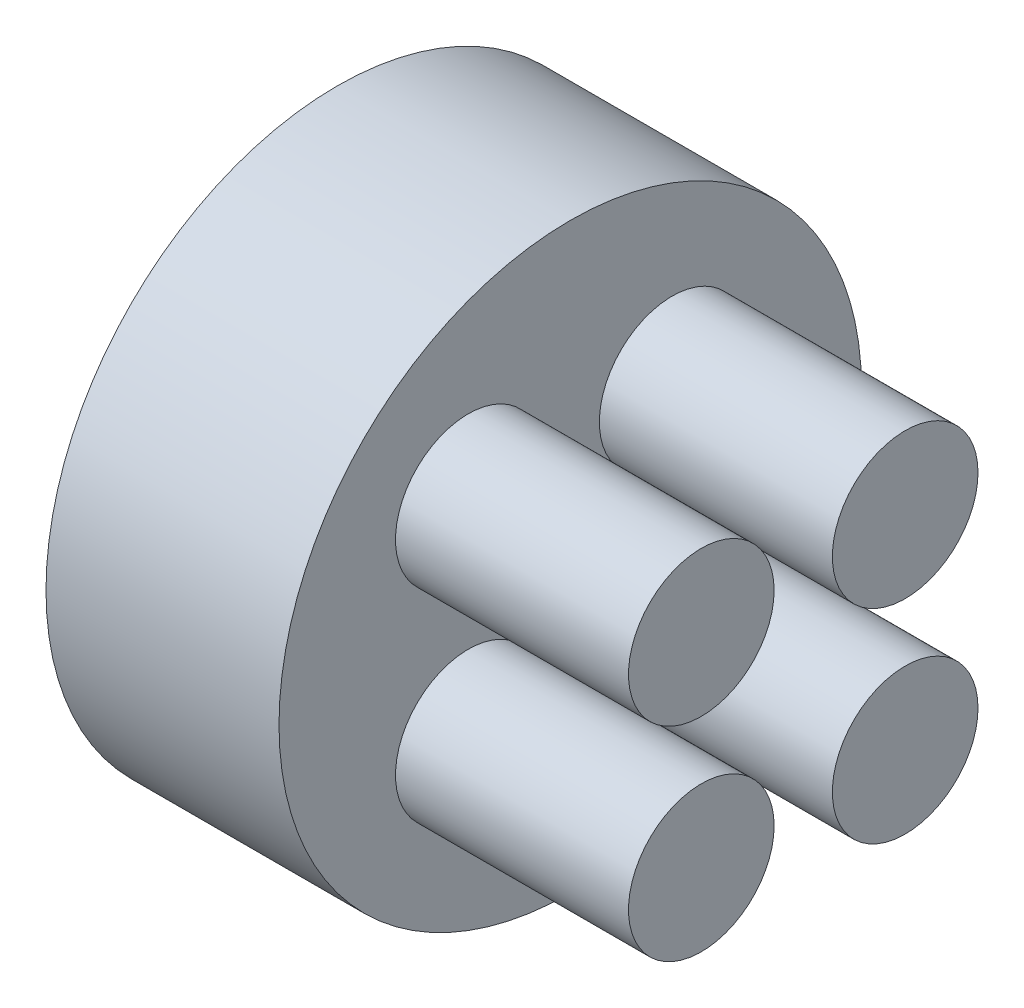
ISO-10303-21;
HEADER;
FILE_DESCRIPTION(('STEP AP214'),'2;1');
FILE_NAME('part.step','',(''),(''),'','','');
FILE_SCHEMA(('AUTOMOTIVE_DESIGN { 1 0 10303 214 1 1 1 1 }'));
ENDSEC;
DATA;
#1=APPLICATION_CONTEXT('core data for automotive mechanical design processes');
#2=APPLICATION_PROTOCOL_DEFINITION('international standard','automotive_design',2000,#1);
#3=PRODUCT_CONTEXT('',#1,'mechanical');
#4=PRODUCT('Part','Part','',(#3));
#5=PRODUCT_RELATED_PRODUCT_CATEGORY('part','',(#4));
#6=PRODUCT_DEFINITION_FORMATION('','',#4);
#7=PRODUCT_DEFINITION_CONTEXT('part definition',#1,'design');
#8=PRODUCT_DEFINITION('design','',#6,#7);
#9=PRODUCT_DEFINITION_SHAPE('','',#8);
#10=(LENGTH_UNIT() NAMED_UNIT(*) SI_UNIT(.MILLI.,.METRE.));
#11=(NAMED_UNIT(*) PLANE_ANGLE_UNIT() SI_UNIT($,.RADIAN.));
#12=(NAMED_UNIT(*) SI_UNIT($,.STERADIAN.) SOLID_ANGLE_UNIT());
#13=UNCERTAINTY_MEASURE_WITH_UNIT(LENGTH_MEASURE(1.E-05),#10,'distance_accuracy_value','');
#14=(GEOMETRIC_REPRESENTATION_CONTEXT(3) GLOBAL_UNCERTAINTY_ASSIGNED_CONTEXT((#13)) GLOBAL_UNIT_ASSIGNED_CONTEXT((#10,
#11,#12)) REPRESENTATION_CONTEXT('',''));
#15=CARTESIAN_POINT('',(0.,0.,0.));
#16=DIRECTION('',(0.,0.,1.));
#17=DIRECTION('',(1.,0.,0.));
#18=AXIS2_PLACEMENT_3D('',#15,#16,#17);
#19=CARTESIAN_POINT('',(8.,0.,0.));
#20=DIRECTION('',(-1.,0.,0.));
#21=DIRECTION('',(0.,0.,1.));
#22=AXIS2_PLACEMENT_3D('',#19,#20,#21);
#23=CYLINDRICAL_SURFACE('',#22,10.);
#24=CARTESIAN_POINT('',(8.,0.,0.));
#25=DIRECTION('',(1.,0.,0.));
#26=DIRECTION('',(0.,0.,-1.));
#27=AXIS2_PLACEMENT_3D('',#24,#25,#26);
#28=CIRCLE('',#27,10.);
#29=CARTESIAN_POINT('',(8.,0.,-10.));
#30=VERTEX_POINT('',#29);
#31=EDGE_CURVE('E10',#30,#30,#28,.T.);
#32=ORIENTED_EDGE('',*,*,#31,.F.);
#33=EDGE_LOOP('',(#32));
#34=FACE_BOUND('',#33,.T.);
#35=CARTESIAN_POINT('',(0.,0.,0.));
#36=DIRECTION('',(1.,0.,0.));
#37=DIRECTION('',(0.,0.,-1.));
#38=AXIS2_PLACEMENT_3D('',#35,#36,#37);
#39=CIRCLE('',#38,10.);
#40=CARTESIAN_POINT('',(0.,0.,-10.));
#41=VERTEX_POINT('',#40);
#42=EDGE_CURVE('E38',#41,#41,#39,.T.);
#43=ORIENTED_EDGE('',*,*,#42,.T.);
#44=EDGE_LOOP('',(#43));
#45=FACE_BOUND('',#44,.T.);
#46=ADVANCED_FACE('F35',(#34,#45),#23,.T.);
#47=CARTESIAN_POINT('',(8.,0.,0.));
#48=DIRECTION('',(1.,0.,0.));
#49=DIRECTION('',(0.,0.,-1.));
#50=AXIS2_PLACEMENT_3D('',#47,#48,#49);
#51=PLANE('',#50);
#52=CARTESIAN_POINT('',(8.,-3.5,-3.5));
#53=DIRECTION('',(1.,0.,0.));
#54=DIRECTION('',(0.,0.,-1.));
#55=AXIS2_PLACEMENT_3D('',#52,#53,#54);
#56=CIRCLE('',#55,2.5);
#57=CARTESIAN_POINT('',(8.,-3.5,-6.));
#58=VERTEX_POINT('',#57);
#59=EDGE_CURVE('E65',#58,#58,#56,.T.);
#60=ORIENTED_EDGE('',*,*,#59,.F.);
#61=EDGE_LOOP('',(#60));
#62=FACE_BOUND('',#61,.T.);
#63=CARTESIAN_POINT('',(8.,-3.5,3.5));
#64=DIRECTION('',(1.,0.,0.));
#65=DIRECTION('',(0.,0.,-1.));
#66=AXIS2_PLACEMENT_3D('',#63,#64,#65);
#67=CIRCLE('',#66,2.5);
#68=CARTESIAN_POINT('',(8.,-3.5,0.999999999999998));
#69=VERTEX_POINT('',#68);
#70=EDGE_CURVE('E59',#69,#69,#67,.T.);
#71=ORIENTED_EDGE('',*,*,#70,.F.);
#72=EDGE_LOOP('',(#71));
#73=FACE_BOUND('',#72,.T.);
#74=CARTESIAN_POINT('',(8.,3.5,-3.5));
#75=DIRECTION('',(1.,0.,0.));
#76=DIRECTION('',(0.,0.,-1.));
#77=AXIS2_PLACEMENT_3D('',#74,#75,#76);
#78=CIRCLE('',#77,2.5);
#79=CARTESIAN_POINT('',(8.,3.5,-6.));
#80=VERTEX_POINT('',#79);
#81=EDGE_CURVE('E53',#80,#80,#78,.T.);
#82=ORIENTED_EDGE('',*,*,#81,.F.);
#83=EDGE_LOOP('',(#82));
#84=FACE_BOUND('',#83,.T.);
#85=CARTESIAN_POINT('',(8.,3.5,3.5));
#86=DIRECTION('',(1.,0.,0.));
#87=DIRECTION('',(0.,0.,-1.));
#88=AXIS2_PLACEMENT_3D('',#85,#86,#87);
#89=CIRCLE('',#88,2.5);
#90=CARTESIAN_POINT('',(8.,3.5,1.));
#91=VERTEX_POINT('',#90);
#92=EDGE_CURVE('E47',#91,#91,#89,.T.);
#93=ORIENTED_EDGE('',*,*,#92,.F.);
#94=EDGE_LOOP('',(#93));
#95=FACE_BOUND('',#94,.T.);
#96=ORIENTED_EDGE('',*,*,#31,.T.);
#97=EDGE_LOOP('',(#96));
#98=FACE_BOUND('',#97,.T.);
#99=ADVANCED_FACE('F90',(#62,#73,#84,#95,#98),#51,.T.);
#100=CARTESIAN_POINT('',(0.,0.,0.));
#101=DIRECTION('',(1.,0.,0.));
#102=DIRECTION('',(0.,0.,-1.));
#103=AXIS2_PLACEMENT_3D('',#100,#101,#102);
#104=PLANE('',#103);
#105=CARTESIAN_POINT('',(0.,0.,0.));
#106=DIRECTION('',(-1.,0.,0.));
#107=DIRECTION('',(0.,0.,1.));
#108=AXIS2_PLACEMENT_3D('',#105,#106,#107);
#109=CIRCLE('',#108,2.9);
#110=CARTESIAN_POINT('',(0.,0.,2.9));
#111=VERTEX_POINT('',#110);
#112=EDGE_CURVE('E71',#111,#111,#109,.T.);
#113=ORIENTED_EDGE('',*,*,#112,.F.);
#114=EDGE_LOOP('',(#113));
#115=FACE_BOUND('',#114,.T.);
#116=ORIENTED_EDGE('',*,*,#42,.F.);
#117=EDGE_LOOP('',(#116));
#118=FACE_BOUND('',#117,.T.);
#119=ADVANCED_FACE('F86',(#115,#118),#104,.F.);
#120=CARTESIAN_POINT('',(16.,3.5,3.5));
#121=DIRECTION('',(-1.,0.,0.));
#122=DIRECTION('',(0.,0.,1.));
#123=AXIS2_PLACEMENT_3D('',#120,#121,#122);
#124=CYLINDRICAL_SURFACE('',#123,2.5);
#125=CARTESIAN_POINT('',(16.,3.5,3.5));
#126=DIRECTION('',(1.,0.,0.));
#127=DIRECTION('',(0.,0.,-1.));
#128=AXIS2_PLACEMENT_3D('',#125,#126,#127);
#129=CIRCLE('',#128,2.5);
#130=CARTESIAN_POINT('',(16.,3.5,1.));
#131=VERTEX_POINT('',#130);
#132=EDGE_CURVE('E45',#131,#131,#129,.T.);
#133=ORIENTED_EDGE('',*,*,#132,.F.);
#134=EDGE_LOOP('',(#133));
#135=FACE_BOUND('',#134,.T.);
#136=ORIENTED_EDGE('',*,*,#92,.T.);
#137=EDGE_LOOP('',(#136));
#138=FACE_BOUND('',#137,.T.);
#139=ADVANCED_FACE('F89',(#135,#138),#124,.T.);
#140=CARTESIAN_POINT('',(16.,3.5,3.5));
#141=DIRECTION('',(1.,0.,0.));
#142=DIRECTION('',(0.,0.,-1.));
#143=AXIS2_PLACEMENT_3D('',#140,#141,#142);
#144=PLANE('',#143);
#145=ORIENTED_EDGE('',*,*,#132,.T.);
#146=EDGE_LOOP('',(#145));
#147=FACE_BOUND('',#146,.T.);
#148=ADVANCED_FACE('F107',(#147),#144,.T.);
#149=CARTESIAN_POINT('',(16.,3.5,-3.5));
#150=DIRECTION('',(-1.,0.,0.));
#151=DIRECTION('',(0.,0.,1.));
#152=AXIS2_PLACEMENT_3D('',#149,#150,#151);
#153=CYLINDRICAL_SURFACE('',#152,2.5);
#154=CARTESIAN_POINT('',(16.,3.5,-3.5));
#155=DIRECTION('',(1.,0.,0.));
#156=DIRECTION('',(0.,0.,-1.));
#157=AXIS2_PLACEMENT_3D('',#154,#155,#156);
#158=CIRCLE('',#157,2.5);
#159=CARTESIAN_POINT('',(16.,3.5,-6.));
#160=VERTEX_POINT('',#159);
#161=EDGE_CURVE('E50',#160,#160,#158,.T.);
#162=ORIENTED_EDGE('',*,*,#161,.F.);
#163=EDGE_LOOP('',(#162));
#164=FACE_BOUND('',#163,.T.);
#165=ORIENTED_EDGE('',*,*,#81,.T.);
#166=EDGE_LOOP('',(#165));
#167=FACE_BOUND('',#166,.T.);
#168=ADVANCED_FACE('F111',(#164,#167),#153,.T.);
#169=CARTESIAN_POINT('',(16.,3.5,-3.5));
#170=DIRECTION('',(1.,0.,0.));
#171=DIRECTION('',(0.,0.,-1.));
#172=AXIS2_PLACEMENT_3D('',#169,#170,#171);
#173=PLANE('',#172);
#174=ORIENTED_EDGE('',*,*,#161,.T.);
#175=EDGE_LOOP('',(#174));
#176=FACE_BOUND('',#175,.T.);
#177=ADVANCED_FACE('F115',(#176),#173,.T.);
#178=CARTESIAN_POINT('',(16.,-3.5,3.5));
#179=DIRECTION('',(-1.,0.,0.));
#180=DIRECTION('',(0.,0.,1.));
#181=AXIS2_PLACEMENT_3D('',#178,#179,#180);
#182=CYLINDRICAL_SURFACE('',#181,2.5);
#183=CARTESIAN_POINT('',(16.,-3.5,3.5));
#184=DIRECTION('',(1.,0.,0.));
#185=DIRECTION('',(0.,0.,-1.));
#186=AXIS2_PLACEMENT_3D('',#183,#184,#185);
#187=CIRCLE('',#186,2.5);
#188=CARTESIAN_POINT('',(16.,-3.5,0.999999999999998));
#189=VERTEX_POINT('',#188);
#190=EDGE_CURVE('E56',#189,#189,#187,.T.);
#191=ORIENTED_EDGE('',*,*,#190,.F.);
#192=EDGE_LOOP('',(#191));
#193=FACE_BOUND('',#192,.T.);
#194=ORIENTED_EDGE('',*,*,#70,.T.);
#195=EDGE_LOOP('',(#194));
#196=FACE_BOUND('',#195,.T.);
#197=ADVANCED_FACE('F119',(#193,#196),#182,.T.);
#198=CARTESIAN_POINT('',(16.,-3.5,3.5));
#199=DIRECTION('',(1.,0.,0.));
#200=DIRECTION('',(0.,0.,-1.));
#201=AXIS2_PLACEMENT_3D('',#198,#199,#200);
#202=PLANE('',#201);
#203=ORIENTED_EDGE('',*,*,#190,.T.);
#204=EDGE_LOOP('',(#203));
#205=FACE_BOUND('',#204,.T.);
#206=ADVANCED_FACE('F123',(#205),#202,.T.);
#207=CARTESIAN_POINT('',(16.,-3.5,-3.5));
#208=DIRECTION('',(-1.,0.,0.));
#209=DIRECTION('',(0.,0.,1.));
#210=AXIS2_PLACEMENT_3D('',#207,#208,#209);
#211=CYLINDRICAL_SURFACE('',#210,2.5);
#212=CARTESIAN_POINT('',(16.,-3.5,-3.5));
#213=DIRECTION('',(1.,0.,0.));
#214=DIRECTION('',(0.,0.,-1.));
#215=AXIS2_PLACEMENT_3D('',#212,#213,#214);
#216=CIRCLE('',#215,2.5);
#217=CARTESIAN_POINT('',(16.,-3.5,-6.));
#218=VERTEX_POINT('',#217);
#219=EDGE_CURVE('E62',#218,#218,#216,.T.);
#220=ORIENTED_EDGE('',*,*,#219,.F.);
#221=EDGE_LOOP('',(#220));
#222=FACE_BOUND('',#221,.T.);
#223=ORIENTED_EDGE('',*,*,#59,.T.);
#224=EDGE_LOOP('',(#223));
#225=FACE_BOUND('',#224,.T.);
#226=ADVANCED_FACE('F127',(#222,#225),#211,.T.);
#227=CARTESIAN_POINT('',(16.,-3.5,-3.5));
#228=DIRECTION('',(1.,0.,0.));
#229=DIRECTION('',(0.,0.,-1.));
#230=AXIS2_PLACEMENT_3D('',#227,#228,#229);
#231=PLANE('',#230);
#232=ORIENTED_EDGE('',*,*,#219,.T.);
#233=EDGE_LOOP('',(#232));
#234=FACE_BOUND('',#233,.T.);
#235=ADVANCED_FACE('F82',(#234),#231,.T.);
#236=CARTESIAN_POINT('',(3.5,0.,0.));
#237=DIRECTION('',(-1.,0.,0.));
#238=DIRECTION('',(0.,0.,1.));
#239=AXIS2_PLACEMENT_3D('',#236,#237,#238);
#240=CYLINDRICAL_SURFACE('',#239,2.9);
#241=CARTESIAN_POINT('',(3.5,0.,0.));
#242=DIRECTION('',(-1.,0.,0.));
#243=DIRECTION('',(0.,0.,1.));
#244=AXIS2_PLACEMENT_3D('',#241,#242,#243);
#245=CIRCLE('',#244,2.9);
#246=CARTESIAN_POINT('',(3.5,0.,2.9));
#247=VERTEX_POINT('',#246);
#248=EDGE_CURVE('E68',#247,#247,#245,.T.);
#249=ORIENTED_EDGE('',*,*,#248,.F.);
#250=EDGE_LOOP('',(#249));
#251=FACE_BOUND('',#250,.T.);
#252=ORIENTED_EDGE('',*,*,#112,.T.);
#253=EDGE_LOOP('',(#252));
#254=FACE_BOUND('',#253,.T.);
#255=ADVANCED_FACE('F79',(#251,#254),#240,.F.);
#256=CARTESIAN_POINT('',(3.5,0.,0.));
#257=DIRECTION('',(-1.,0.,0.));
#258=DIRECTION('',(0.,0.,1.));
#259=AXIS2_PLACEMENT_3D('',#256,#257,#258);
#260=PLANE('',#259);
#261=ORIENTED_EDGE('',*,*,#248,.T.);
#262=EDGE_LOOP('',(#261));
#263=FACE_BOUND('',#262,.T.);
#264=ADVANCED_FACE('F77',(#263),#260,.T.);
#265=CLOSED_SHELL('',(#46,#99,#119,#139,#148,#168,#177,#197,#206,#226,#235,#255,#264));
#266=MANIFOLD_SOLID_BREP('B2',#265);
#267=ADVANCED_BREP_SHAPE_REPRESENTATION('',(#18,#266),#14);
#268=SHAPE_DEFINITION_REPRESENTATION(#9,#267);
ENDSEC;
END-ISO-10303-21;
